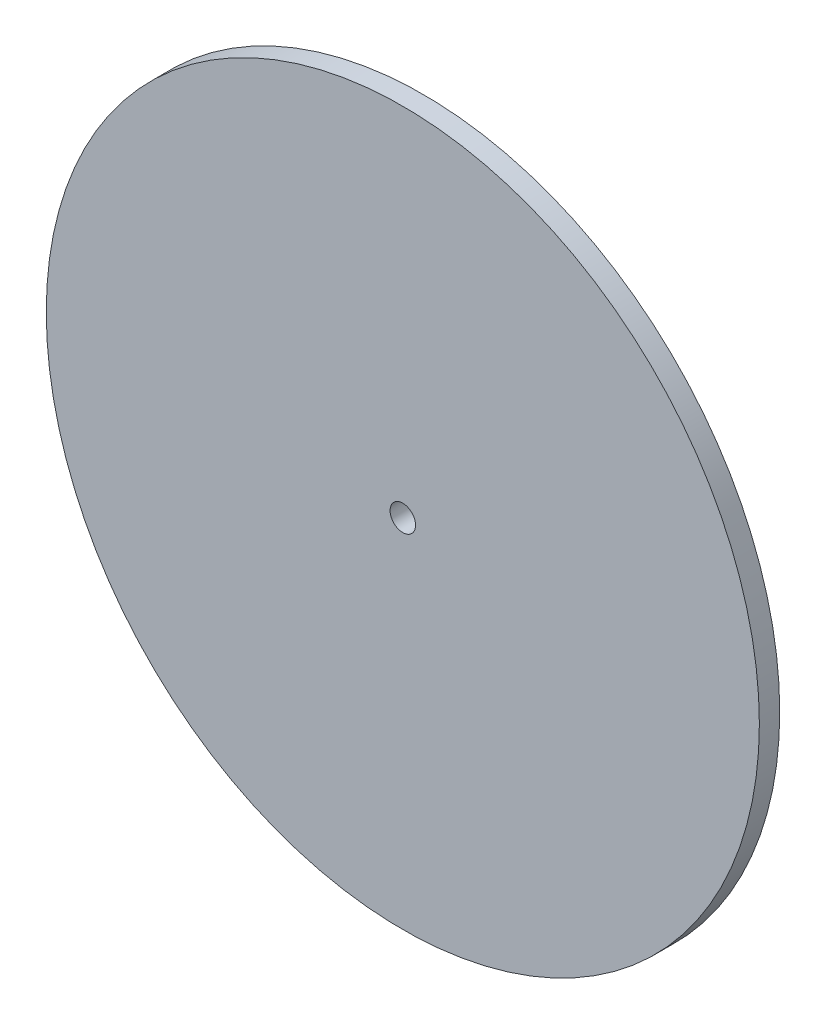
ISO-10303-21;
HEADER;
FILE_DESCRIPTION(('STEP AP214'),'2;1');
FILE_NAME('part.step','',(''),(''),'','','');
FILE_SCHEMA(('AUTOMOTIVE_DESIGN { 1 0 10303 214 1 1 1 1 }'));
ENDSEC;
DATA;
#1=APPLICATION_CONTEXT('core data for automotive mechanical design processes');
#2=APPLICATION_PROTOCOL_DEFINITION('international standard','automotive_design',2000,#1);
#3=PRODUCT_CONTEXT('',#1,'mechanical');
#4=PRODUCT('Part','Part','',(#3));
#5=PRODUCT_RELATED_PRODUCT_CATEGORY('part','',(#4));
#6=PRODUCT_DEFINITION_FORMATION('','',#4);
#7=PRODUCT_DEFINITION_CONTEXT('part definition',#1,'design');
#8=PRODUCT_DEFINITION('design','',#6,#7);
#9=PRODUCT_DEFINITION_SHAPE('','',#8);
#10=(LENGTH_UNIT() NAMED_UNIT(*) SI_UNIT(.MILLI.,.METRE.));
#11=(NAMED_UNIT(*) PLANE_ANGLE_UNIT() SI_UNIT($,.RADIAN.));
#12=(NAMED_UNIT(*) SI_UNIT($,.STERADIAN.) SOLID_ANGLE_UNIT());
#13=UNCERTAINTY_MEASURE_WITH_UNIT(LENGTH_MEASURE(1.E-05),#10,'distance_accuracy_value','');
#14=(GEOMETRIC_REPRESENTATION_CONTEXT(3) GLOBAL_UNCERTAINTY_ASSIGNED_CONTEXT((#13)) GLOBAL_UNIT_ASSIGNED_CONTEXT((#10,
#11,#12)) REPRESENTATION_CONTEXT('',''));
#15=CARTESIAN_POINT('',(0.,0.,0.));
#16=DIRECTION('',(0.,0.,1.));
#17=DIRECTION('',(1.,0.,0.));
#18=AXIS2_PLACEMENT_3D('',#15,#16,#17);
#19=CARTESIAN_POINT('',(0.,0.,4.));
#20=DIRECTION('',(0.,0.,-1.));
#21=DIRECTION('',(-1.,0.,0.));
#22=AXIS2_PLACEMENT_3D('',#19,#20,#21);
#23=CYLINDRICAL_SURFACE('',#22,70.);
#24=CARTESIAN_POINT('',(0.,0.,4.));
#25=DIRECTION('',(0.,0.,1.));
#26=DIRECTION('',(1.,0.,0.));
#27=AXIS2_PLACEMENT_3D('',#24,#25,#26);
#28=CIRCLE('',#27,70.);
#29=CARTESIAN_POINT('',(70.,0.,4.));
#30=VERTEX_POINT('',#29);
#31=EDGE_CURVE('E10',#30,#30,#28,.T.);
#32=ORIENTED_EDGE('',*,*,#31,.F.);
#33=EDGE_LOOP('',(#32));
#34=FACE_BOUND('',#33,.T.);
#35=CARTESIAN_POINT('',(0.,0.,0.));
#36=DIRECTION('',(0.,0.,1.));
#37=DIRECTION('',(1.,0.,0.));
#38=AXIS2_PLACEMENT_3D('',#35,#36,#37);
#39=CIRCLE('',#38,70.);
#40=CARTESIAN_POINT('',(70.,0.,0.));
#41=VERTEX_POINT('',#40);
#42=EDGE_CURVE('E43',#41,#41,#39,.T.);
#43=ORIENTED_EDGE('',*,*,#42,.T.);
#44=EDGE_LOOP('',(#43));
#45=FACE_BOUND('',#44,.T.);
#46=ADVANCED_FACE('F40',(#34,#45),#23,.T.);
#47=CARTESIAN_POINT('',(0.,0.,4.));
#48=DIRECTION('',(0.,0.,1.));
#49=DIRECTION('',(1.,0.,0.));
#50=AXIS2_PLACEMENT_3D('',#47,#48,#49);
#51=PLANE('',#50);
#52=CARTESIAN_POINT('',(0.,0.,4.));
#53=DIRECTION('',(0.,0.,-1.));
#54=DIRECTION('',(-1.,0.,0.));
#55=AXIS2_PLACEMENT_3D('',#52,#53,#54);
#56=CIRCLE('',#55,2.5);
#57=CARTESIAN_POINT('',(-2.5,0.,4.));
#58=VERTEX_POINT('',#57);
#59=EDGE_CURVE('E52',#58,#58,#56,.T.);
#60=ORIENTED_EDGE('',*,*,#59,.T.);
#61=EDGE_LOOP('',(#60));
#62=FACE_BOUND('',#61,.T.);
#63=ORIENTED_EDGE('',*,*,#31,.T.);
#64=EDGE_LOOP('',(#63));
#65=FACE_BOUND('',#64,.T.);
#66=ADVANCED_FACE('F62',(#62,#65),#51,.T.);
#67=CARTESIAN_POINT('',(0.,0.,0.));
#68=DIRECTION('',(0.,0.,1.));
#69=DIRECTION('',(1.,0.,0.));
#70=AXIS2_PLACEMENT_3D('',#67,#68,#69);
#71=PLANE('',#70);
#72=CARTESIAN_POINT('',(0.,0.,0.));
#73=DIRECTION('',(0.,0.,-1.));
#74=DIRECTION('',(-1.,0.,0.));
#75=AXIS2_PLACEMENT_3D('',#72,#73,#74);
#76=CIRCLE('',#75,2.5);
#77=CARTESIAN_POINT('',(-2.5,0.,0.));
#78=VERTEX_POINT('',#77);
#79=EDGE_CURVE('E54',#78,#78,#76,.T.);
#80=ORIENTED_EDGE('',*,*,#79,.F.);
#81=EDGE_LOOP('',(#80));
#82=FACE_BOUND('',#81,.T.);
#83=ORIENTED_EDGE('',*,*,#42,.F.);
#84=EDGE_LOOP('',(#83));
#85=FACE_BOUND('',#84,.T.);
#86=ADVANCED_FACE('F67',(#82,#85),#71,.F.);
#87=CARTESIAN_POINT('',(0.,0.,4.));
#88=DIRECTION('',(0.,0.,-1.));
#89=DIRECTION('',(-1.,0.,0.));
#90=AXIS2_PLACEMENT_3D('',#87,#88,#89);
#91=CYLINDRICAL_SURFACE('',#90,2.5);
#92=ORIENTED_EDGE('',*,*,#59,.F.);
#93=EDGE_LOOP('',(#92));
#94=FACE_BOUND('',#93,.T.);
#95=ORIENTED_EDGE('',*,*,#79,.T.);
#96=EDGE_LOOP('',(#95));
#97=FACE_BOUND('',#96,.T.);
#98=ADVANCED_FACE('F64',(#94,#97),#91,.F.);
#99=CLOSED_SHELL('',(#46,#66,#86,#98));
#100=MANIFOLD_SOLID_BREP('B2',#99);
#101=ADVANCED_BREP_SHAPE_REPRESENTATION('',(#18,#100),#14);
#102=SHAPE_DEFINITION_REPRESENTATION(#9,#101);
ENDSEC;
END-ISO-10303-21;
